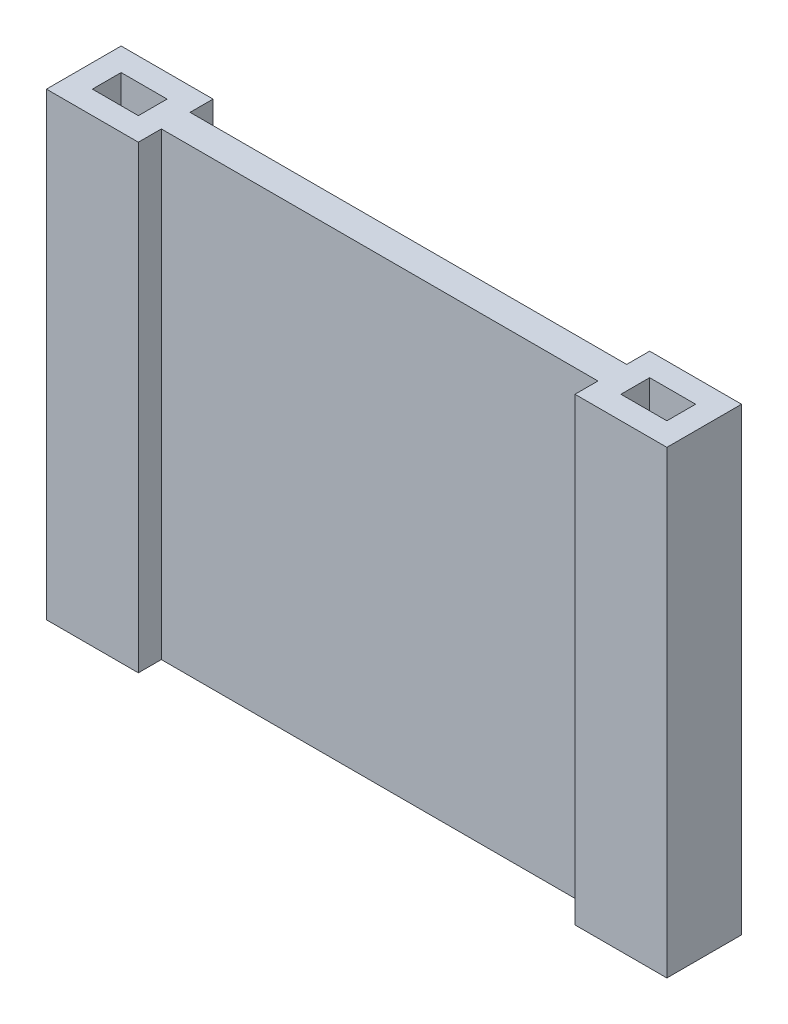
ISO-10303-21;
HEADER;
FILE_DESCRIPTION(('STEP AP214'),'2;1');
FILE_NAME('part.step','',(''),(''),'','','');
FILE_SCHEMA(('AUTOMOTIVE_DESIGN { 1 0 10303 214 1 1 1 1 }'));
ENDSEC;
DATA;
#1=APPLICATION_CONTEXT('core data for automotive mechanical design processes');
#2=APPLICATION_PROTOCOL_DEFINITION('international standard','automotive_design',2000,#1);
#3=PRODUCT_CONTEXT('',#1,'mechanical');
#4=PRODUCT('Part','Part','',(#3));
#5=PRODUCT_RELATED_PRODUCT_CATEGORY('part','',(#4));
#6=PRODUCT_DEFINITION_FORMATION('','',#4);
#7=PRODUCT_DEFINITION_CONTEXT('part definition',#1,'design');
#8=PRODUCT_DEFINITION('design','',#6,#7);
#9=PRODUCT_DEFINITION_SHAPE('','',#8);
#10=(LENGTH_UNIT() NAMED_UNIT(*) SI_UNIT(.MILLI.,.METRE.));
#11=(NAMED_UNIT(*) PLANE_ANGLE_UNIT() SI_UNIT($,.RADIAN.));
#12=(NAMED_UNIT(*) SI_UNIT($,.STERADIAN.) SOLID_ANGLE_UNIT());
#13=UNCERTAINTY_MEASURE_WITH_UNIT(LENGTH_MEASURE(1.E-05),#10,'distance_accuracy_value','');
#14=(GEOMETRIC_REPRESENTATION_CONTEXT(3) GLOBAL_UNCERTAINTY_ASSIGNED_CONTEXT((#13)) GLOBAL_UNIT_ASSIGNED_CONTEXT((#10,
#11,#12)) REPRESENTATION_CONTEXT('',''));
#15=CARTESIAN_POINT('',(0.,0.,0.));
#16=DIRECTION('',(0.,0.,1.));
#17=DIRECTION('',(1.,0.,0.));
#18=AXIS2_PLACEMENT_3D('',#15,#16,#17);
#19=CARTESIAN_POINT('',(80.,-80.,5.));
#20=DIRECTION('',(-1.,0.,0.));
#21=DIRECTION('',(0.,-1.,0.));
#22=AXIS2_PLACEMENT_3D('',#19,#20,#21);
#23=PLANE('',#22);
#24=DIRECTION('',(0.,-1.,0.));
#25=VECTOR('',#24,1.);
#26=CARTESIAN_POINT('',(80.,0.,0.));
#27=LINE('',#26,#25);
#28=CARTESIAN_POINT('',(80.,0.,0.));
#29=VERTEX_POINT('',#28);
#30=CARTESIAN_POINT('',(80.,-80.,0.));
#31=VERTEX_POINT('',#30);
#32=EDGE_CURVE('E258',#29,#31,#27,.T.);
#33=ORIENTED_EDGE('',*,*,#32,.F.);
#34=DIRECTION('',(0.,0.,-1.));
#35=VECTOR('',#34,1.);
#36=CARTESIAN_POINT('',(80.,0.,5.));
#37=LINE('',#36,#35);
#38=CARTESIAN_POINT('',(80.,0.,5.));
#39=VERTEX_POINT('',#38);
#40=EDGE_CURVE('E42',#39,#29,#37,.T.);
#41=ORIENTED_EDGE('',*,*,#40,.F.);
#42=DIRECTION('',(0.,1.,0.));
#43=VECTOR('',#42,1.);
#44=CARTESIAN_POINT('',(80.,-80.,5.));
#45=LINE('',#44,#43);
#46=CARTESIAN_POINT('',(80.,-80.,5.));
#47=VERTEX_POINT('',#46);
#48=EDGE_CURVE('E266',#47,#39,#45,.T.);
#49=ORIENTED_EDGE('',*,*,#48,.F.);
#50=DIRECTION('',(0.,0.,-1.));
#51=VECTOR('',#50,1.);
#52=CARTESIAN_POINT('',(80.,-80.,5.));
#53=LINE('',#52,#51);
#54=EDGE_CURVE('E11',#47,#31,#53,.T.);
#55=ORIENTED_EDGE('',*,*,#54,.T.);
#56=EDGE_LOOP('',(#33,#41,#49,#55));
#57=FACE_BOUND('',#56,.T.);
#58=ADVANCED_FACE('F34',(#57),#23,.F.);
#59=CARTESIAN_POINT('',(0.,0.,5.));
#60=DIRECTION('',(0.,0.,1.));
#61=DIRECTION('',(1.,0.,0.));
#62=AXIS2_PLACEMENT_3D('',#59,#60,#61);
#63=PLANE('',#62);
#64=DIRECTION('',(1.,0.,0.));
#65=VECTOR('',#64,1.);
#66=CARTESIAN_POINT('',(0.,-80.,5.));
#67=LINE('',#66,#65);
#68=CARTESIAN_POINT('',(0.,-80.,5.));
#69=VERTEX_POINT('',#68);
#70=CARTESIAN_POINT('',(76.,-80.,5.));
#71=VERTEX_POINT('',#70);
#72=EDGE_CURVE('E323',#69,#71,#67,.T.);
#73=ORIENTED_EDGE('',*,*,#72,.T.);
#74=DIRECTION('',(0.,1.,0.));
#75=VECTOR('',#74,1.);
#76=CARTESIAN_POINT('',(76.,-80.,5.));
#77=LINE('',#76,#75);
#78=CARTESIAN_POINT('',(76.,0.,5.));
#79=VERTEX_POINT('',#78);
#80=EDGE_CURVE('E297',#71,#79,#77,.T.);
#81=ORIENTED_EDGE('',*,*,#80,.T.);
#82=DIRECTION('',(-1.,0.,0.));
#83=VECTOR('',#82,1.);
#84=CARTESIAN_POINT('',(80.,0.,5.));
#85=LINE('',#84,#83);
#86=CARTESIAN_POINT('',(0.,0.,5.));
#87=VERTEX_POINT('',#86);
#88=EDGE_CURVE('E316',#79,#87,#85,.T.);
#89=ORIENTED_EDGE('',*,*,#88,.T.);
#90=DIRECTION('',(0.,-1.,0.));
#91=VECTOR('',#90,1.);
#92=CARTESIAN_POINT('',(0.,0.,5.));
#93=LINE('',#92,#91);
#94=EDGE_CURVE('E319',#87,#69,#93,.T.);
#95=ORIENTED_EDGE('',*,*,#94,.T.);
#96=EDGE_LOOP('',(#73,#81,#89,#95));
#97=FACE_BOUND('',#96,.T.);
#98=ADVANCED_FACE('F362',(#97),#63,.T.);
#99=CARTESIAN_POINT('',(80.,0.,5.));
#100=DIRECTION('',(0.,-1.,0.));
#101=DIRECTION('',(1.,0.,0.));
#102=AXIS2_PLACEMENT_3D('',#99,#100,#101);
#103=PLANE('',#102);
#104=DIRECTION('',(0.,0.,1.));
#105=VECTOR('',#104,1.);
#106=CARTESIAN_POINT('',(88.,0.,0.));
#107=LINE('',#106,#105);
#108=CARTESIAN_POINT('',(88.,0.,0.));
#109=VERTEX_POINT('',#108);
#110=CARTESIAN_POINT('',(88.,0.,5.));
#111=VERTEX_POINT('',#110);
#112=EDGE_CURVE('E49',#109,#111,#107,.T.);
#113=ORIENTED_EDGE('',*,*,#112,.T.);
#114=DIRECTION('',(-1.,0.,0.));
#115=VECTOR('',#114,1.);
#116=CARTESIAN_POINT('',(92.,0.,5.));
#117=LINE('',#116,#115);
#118=EDGE_CURVE('E279',#111,#39,#117,.T.);
#119=ORIENTED_EDGE('',*,*,#118,.T.);
#120=ORIENTED_EDGE('',*,*,#40,.T.);
#121=DIRECTION('',(-1.,0.,0.));
#122=VECTOR('',#121,1.);
#123=CARTESIAN_POINT('',(92.,0.,0.));
#124=LINE('',#123,#122);
#125=EDGE_CURVE('E56',#109,#29,#124,.T.);
#126=ORIENTED_EDGE('',*,*,#125,.F.);
#127=EDGE_LOOP('',(#113,#119,#120,#126));
#128=FACE_BOUND('',#127,.T.);
#129=DIRECTION('',(1.,0.,0.));
#130=VECTOR('',#129,1.);
#131=CARTESIAN_POINT('',(76.,0.,9.));
#132=LINE('',#131,#130);
#133=CARTESIAN_POINT('',(76.,0.,9.));
#134=VERTEX_POINT('',#133);
#135=CARTESIAN_POINT('',(92.,0.,9.));
#136=VERTEX_POINT('',#135);
#137=EDGE_CURVE('E311',#134,#136,#132,.T.);
#138=ORIENTED_EDGE('',*,*,#137,.T.);
#139=DIRECTION('',(0.,0.,1.));
#140=VECTOR('',#139,1.);
#141=CARTESIAN_POINT('',(92.,0.,5.));
#142=LINE('',#141,#140);
#143=CARTESIAN_POINT('',(92.,0.,-4.));
#144=VERTEX_POINT('',#143);
#145=EDGE_CURVE('E267',#144,#136,#142,.T.);
#146=ORIENTED_EDGE('',*,*,#145,.F.);
#147=DIRECTION('',(1.,0.,0.));
#148=VECTOR('',#147,1.);
#149=CARTESIAN_POINT('',(76.,0.,-4.));
#150=LINE('',#149,#148);
#151=CARTESIAN_POINT('',(76.,0.,-4.));
#152=VERTEX_POINT('',#151);
#153=EDGE_CURVE('E294',#152,#144,#150,.T.);
#154=ORIENTED_EDGE('',*,*,#153,.F.);
#155=DIRECTION('',(0.,0.,1.));
#156=VECTOR('',#155,1.);
#157=CARTESIAN_POINT('',(76.,0.,0.));
#158=LINE('',#157,#156);
#159=CARTESIAN_POINT('',(76.,0.,0.));
#160=VERTEX_POINT('',#159);
#161=EDGE_CURVE('E290',#152,#160,#158,.T.);
#162=ORIENTED_EDGE('',*,*,#161,.T.);
#163=DIRECTION('',(-1.,0.,0.));
#164=VECTOR('',#163,1.);
#165=CARTESIAN_POINT('',(80.,0.,0.));
#166=LINE('',#165,#164);
#167=CARTESIAN_POINT('',(0.,0.,0.));
#168=VERTEX_POINT('',#167);
#169=EDGE_CURVE('E314',#160,#168,#166,.T.);
#170=ORIENTED_EDGE('',*,*,#169,.T.);
#171=DIRECTION('',(0.,0.,-1.));
#172=VECTOR('',#171,1.);
#173=CARTESIAN_POINT('',(0.,0.,0.));
#174=LINE('',#173,#172);
#175=CARTESIAN_POINT('',(0.,0.,-4.));
#176=VERTEX_POINT('',#175);
#177=EDGE_CURVE('E206',#168,#176,#174,.T.);
#178=ORIENTED_EDGE('',*,*,#177,.T.);
#179=DIRECTION('',(-1.,0.,0.));
#180=VECTOR('',#179,1.);
#181=CARTESIAN_POINT('',(0.,0.,-4.));
#182=LINE('',#181,#180);
#183=CARTESIAN_POINT('',(-16.,0.,-4.));
#184=VERTEX_POINT('',#183);
#185=EDGE_CURVE('E180',#176,#184,#182,.T.);
#186=ORIENTED_EDGE('',*,*,#185,.T.);
#187=DIRECTION('',(0.,0.,1.));
#188=VECTOR('',#187,1.);
#189=CARTESIAN_POINT('',(-16.,0.,0.));
#190=LINE('',#189,#188);
#191=CARTESIAN_POINT('',(-16.,0.,9.));
#192=VERTEX_POINT('',#191);
#193=EDGE_CURVE('E172',#184,#192,#190,.T.);
#194=ORIENTED_EDGE('',*,*,#193,.T.);
#195=DIRECTION('',(1.,0.,0.));
#196=VECTOR('',#195,1.);
#197=CARTESIAN_POINT('',(0.,0.,9.));
#198=LINE('',#197,#196);
#199=CARTESIAN_POINT('',(0.,0.,9.));
#200=VERTEX_POINT('',#199);
#201=EDGE_CURVE('E177',#192,#200,#198,.T.);
#202=ORIENTED_EDGE('',*,*,#201,.T.);
#203=EDGE_CURVE('E207',#200,#87,#174,.T.);
#204=ORIENTED_EDGE('',*,*,#203,.T.);
#205=ORIENTED_EDGE('',*,*,#88,.F.);
#206=DIRECTION('',(0.,0.,1.));
#207=VECTOR('',#206,1.);
#208=CARTESIAN_POINT('',(76.,0.,5.));
#209=LINE('',#208,#207);
#210=EDGE_CURVE('E302',#79,#134,#209,.T.);
#211=ORIENTED_EDGE('',*,*,#210,.T.);
#212=EDGE_LOOP('',(#138,#146,#154,#162,#170,#178,#186,#194,#202,#204,#205,#211));
#213=FACE_BOUND('',#212,.T.);
#214=DIRECTION('',(0.,0.,1.));
#215=VECTOR('',#214,1.);
#216=CARTESIAN_POINT('',(-12.,0.,0.));
#217=LINE('',#216,#215);
#218=CARTESIAN_POINT('',(-12.,0.,0.));
#219=VERTEX_POINT('',#218);
#220=CARTESIAN_POINT('',(-12.,0.,5.));
#221=VERTEX_POINT('',#220);
#222=EDGE_CURVE('E209',#219,#221,#217,.T.);
#223=ORIENTED_EDGE('',*,*,#222,.F.);
#224=DIRECTION('',(-1.,0.,0.));
#225=VECTOR('',#224,1.);
#226=CARTESIAN_POINT('',(0.,0.,0.));
#227=LINE('',#226,#225);
#228=CARTESIAN_POINT('',(-4.,0.,0.));
#229=VERTEX_POINT('',#228);
#230=EDGE_CURVE('E194',#229,#219,#227,.T.);
#231=ORIENTED_EDGE('',*,*,#230,.F.);
#232=DIRECTION('',(0.,0.,-1.));
#233=VECTOR('',#232,1.);
#234=CARTESIAN_POINT('',(-4.,0.,0.));
#235=LINE('',#234,#233);
#236=CARTESIAN_POINT('',(-4.,0.,5.));
#237=VERTEX_POINT('',#236);
#238=EDGE_CURVE('E215',#237,#229,#235,.T.);
#239=ORIENTED_EDGE('',*,*,#238,.F.);
#240=DIRECTION('',(1.,0.,0.));
#241=VECTOR('',#240,1.);
#242=CARTESIAN_POINT('',(0.,0.,5.));
#243=LINE('',#242,#241);
#244=EDGE_CURVE('E212',#221,#237,#243,.T.);
#245=ORIENTED_EDGE('',*,*,#244,.F.);
#246=EDGE_LOOP('',(#223,#231,#239,#245));
#247=FACE_BOUND('',#246,.T.);
#248=ADVANCED_FACE('F36',(#128,#213,#247),#103,.F.);
#249=CARTESIAN_POINT('',(0.,-80.,5.));
#250=DIRECTION('',(0.,1.,0.));
#251=DIRECTION('',(0.,0.,1.));
#252=AXIS2_PLACEMENT_3D('',#249,#250,#251);
#253=PLANE('',#252);
#254=DIRECTION('',(0.,0.,-1.));
#255=VECTOR('',#254,1.);
#256=CARTESIAN_POINT('',(92.,-80.,9.));
#257=LINE('',#256,#255);
#258=CARTESIAN_POINT('',(92.,-80.,9.));
#259=VERTEX_POINT('',#258);
#260=CARTESIAN_POINT('',(92.,-80.,-4.));
#261=VERTEX_POINT('',#260);
#262=EDGE_CURVE('E273',#259,#261,#257,.T.);
#263=ORIENTED_EDGE('',*,*,#262,.F.);
#264=DIRECTION('',(1.,0.,0.));
#265=VECTOR('',#264,1.);
#266=CARTESIAN_POINT('',(76.,-80.,9.));
#267=LINE('',#266,#265);
#268=CARTESIAN_POINT('',(76.,-80.,9.));
#269=VERTEX_POINT('',#268);
#270=EDGE_CURVE('E312',#269,#259,#267,.T.);
#271=ORIENTED_EDGE('',*,*,#270,.F.);
#272=DIRECTION('',(0.,0.,-1.));
#273=VECTOR('',#272,1.);
#274=CARTESIAN_POINT('',(76.,-80.,9.));
#275=LINE('',#274,#273);
#276=EDGE_CURVE('E308',#269,#71,#275,.T.);
#277=ORIENTED_EDGE('',*,*,#276,.T.);
#278=ORIENTED_EDGE('',*,*,#72,.F.);
#279=DIRECTION('',(0.,0.,-1.));
#280=VECTOR('',#279,1.);
#281=CARTESIAN_POINT('',(0.,-80.,0.));
#282=LINE('',#281,#280);
#283=CARTESIAN_POINT('',(0.,-80.,9.));
#284=VERTEX_POINT('',#283);
#285=EDGE_CURVE('E226',#284,#69,#282,.T.);
#286=ORIENTED_EDGE('',*,*,#285,.F.);
#287=DIRECTION('',(1.,0.,0.));
#288=VECTOR('',#287,1.);
#289=CARTESIAN_POINT('',(0.,-80.,9.));
#290=LINE('',#289,#288);
#291=CARTESIAN_POINT('',(-16.,-80.,9.));
#292=VERTEX_POINT('',#291);
#293=EDGE_CURVE('E220',#292,#284,#290,.T.);
#294=ORIENTED_EDGE('',*,*,#293,.F.);
#295=DIRECTION('',(0.,0.,1.));
#296=VECTOR('',#295,1.);
#297=CARTESIAN_POINT('',(-16.,-80.,0.));
#298=LINE('',#297,#296);
#299=CARTESIAN_POINT('',(-16.,-80.,-4.));
#300=VERTEX_POINT('',#299);
#301=EDGE_CURVE('E189',#300,#292,#298,.T.);
#302=ORIENTED_EDGE('',*,*,#301,.F.);
#303=DIRECTION('',(-1.,0.,0.));
#304=VECTOR('',#303,1.);
#305=CARTESIAN_POINT('',(0.,-80.,-4.));
#306=LINE('',#305,#304);
#307=CARTESIAN_POINT('',(0.,-80.,-4.));
#308=VERTEX_POINT('',#307);
#309=EDGE_CURVE('E223',#308,#300,#306,.T.);
#310=ORIENTED_EDGE('',*,*,#309,.F.);
#311=CARTESIAN_POINT('',(0.,-80.,0.));
#312=VERTEX_POINT('',#311);
#313=EDGE_CURVE('E225',#312,#308,#282,.T.);
#314=ORIENTED_EDGE('',*,*,#313,.F.);
#315=DIRECTION('',(1.,0.,0.));
#316=VECTOR('',#315,1.);
#317=CARTESIAN_POINT('',(0.,-80.,0.));
#318=LINE('',#317,#316);
#319=CARTESIAN_POINT('',(76.,-80.,0.));
#320=VERTEX_POINT('',#319);
#321=EDGE_CURVE('E320',#312,#320,#318,.T.);
#322=ORIENTED_EDGE('',*,*,#321,.T.);
#323=DIRECTION('',(0.,0.,-1.));
#324=VECTOR('',#323,1.);
#325=CARTESIAN_POINT('',(76.,-80.,0.));
#326=LINE('',#325,#324);
#327=CARTESIAN_POINT('',(76.,-80.,-4.));
#328=VERTEX_POINT('',#327);
#329=EDGE_CURVE('E284',#320,#328,#326,.T.);
#330=ORIENTED_EDGE('',*,*,#329,.T.);
#331=DIRECTION('',(1.,0.,0.));
#332=VECTOR('',#331,1.);
#333=CARTESIAN_POINT('',(76.,-80.,-4.));
#334=LINE('',#333,#332);
#335=EDGE_CURVE('E293',#328,#261,#334,.T.);
#336=ORIENTED_EDGE('',*,*,#335,.T.);
#337=EDGE_LOOP('',(#263,#271,#277,#278,#286,#294,#302,#310,#314,#322,#330,#336));
#338=FACE_BOUND('',#337,.T.);
#339=DIRECTION('',(-1.,0.,0.));
#340=VECTOR('',#339,1.);
#341=CARTESIAN_POINT('',(92.,-80.,5.));
#342=LINE('',#341,#340);
#343=CARTESIAN_POINT('',(88.,-80.,5.));
#344=VERTEX_POINT('',#343);
#345=EDGE_CURVE('E275',#344,#47,#342,.T.);
#346=ORIENTED_EDGE('',*,*,#345,.F.);
#347=DIRECTION('',(0.,0.,1.));
#348=VECTOR('',#347,1.);
#349=CARTESIAN_POINT('',(88.,-80.,0.));
#350=LINE('',#349,#348);
#351=CARTESIAN_POINT('',(88.,-80.,0.));
#352=VERTEX_POINT('',#351);
#353=EDGE_CURVE('E252',#352,#344,#350,.T.);
#354=ORIENTED_EDGE('',*,*,#353,.F.);
#355=DIRECTION('',(-1.,0.,0.));
#356=VECTOR('',#355,1.);
#357=CARTESIAN_POINT('',(92.,-80.,0.));
#358=LINE('',#357,#356);
#359=EDGE_CURVE('E264',#352,#31,#358,.T.);
#360=ORIENTED_EDGE('',*,*,#359,.T.);
#361=ORIENTED_EDGE('',*,*,#54,.F.);
#362=EDGE_LOOP('',(#346,#354,#360,#361));
#363=FACE_BOUND('',#362,.T.);
#364=DIRECTION('',(0.,0.,1.));
#365=VECTOR('',#364,1.);
#366=CARTESIAN_POINT('',(-12.,-80.,0.));
#367=LINE('',#366,#365);
#368=CARTESIAN_POINT('',(-12.,-80.,0.));
#369=VERTEX_POINT('',#368);
#370=CARTESIAN_POINT('',(-12.,-80.,5.));
#371=VERTEX_POINT('',#370);
#372=EDGE_CURVE('E228',#369,#371,#367,.T.);
#373=ORIENTED_EDGE('',*,*,#372,.T.);
#374=DIRECTION('',(1.,0.,0.));
#375=VECTOR('',#374,1.);
#376=CARTESIAN_POINT('',(0.,-80.,5.));
#377=LINE('',#376,#375);
#378=CARTESIAN_POINT('',(-4.,-80.,5.));
#379=VERTEX_POINT('',#378);
#380=EDGE_CURVE('E231',#371,#379,#377,.T.);
#381=ORIENTED_EDGE('',*,*,#380,.T.);
#382=DIRECTION('',(0.,0.,-1.));
#383=VECTOR('',#382,1.);
#384=CARTESIAN_POINT('',(-4.,-80.,0.));
#385=LINE('',#384,#383);
#386=CARTESIAN_POINT('',(-4.,-80.,0.));
#387=VERTEX_POINT('',#386);
#388=EDGE_CURVE('E202',#379,#387,#385,.T.);
#389=ORIENTED_EDGE('',*,*,#388,.T.);
#390=DIRECTION('',(-1.,0.,0.));
#391=VECTOR('',#390,1.);
#392=CARTESIAN_POINT('',(0.,-80.,0.));
#393=LINE('',#392,#391);
#394=EDGE_CURVE('E199',#387,#369,#393,.T.);
#395=ORIENTED_EDGE('',*,*,#394,.T.);
#396=EDGE_LOOP('',(#373,#381,#389,#395));
#397=FACE_BOUND('',#396,.T.);
#398=ADVANCED_FACE('F341',(#338,#363,#397),#253,.F.);
#399=CARTESIAN_POINT('',(0.,0.,0.));
#400=DIRECTION('',(0.,0.,1.));
#401=DIRECTION('',(1.,0.,0.));
#402=AXIS2_PLACEMENT_3D('',#399,#400,#401);
#403=PLANE('',#402);
#404=ORIENTED_EDGE('',*,*,#169,.F.);
#405=DIRECTION('',(0.,-1.,0.));
#406=VECTOR('',#405,1.);
#407=CARTESIAN_POINT('',(76.,0.,0.));
#408=LINE('',#407,#406);
#409=EDGE_CURVE('E281',#160,#320,#408,.T.);
#410=ORIENTED_EDGE('',*,*,#409,.T.);
#411=ORIENTED_EDGE('',*,*,#321,.F.);
#412=DIRECTION('',(0.,-1.,0.));
#413=VECTOR('',#412,1.);
#414=CARTESIAN_POINT('',(0.,0.,0.));
#415=LINE('',#414,#413);
#416=EDGE_CURVE('E328',#168,#312,#415,.T.);
#417=ORIENTED_EDGE('',*,*,#416,.F.);
#418=EDGE_LOOP('',(#404,#410,#411,#417));
#419=FACE_BOUND('',#418,.T.);
#420=ADVANCED_FACE('F370',(#419),#403,.F.);
#421=CARTESIAN_POINT('',(76.,0.,9.));
#422=DIRECTION('',(0.,0.,1.));
#423=DIRECTION('',(1.,0.,0.));
#424=AXIS2_PLACEMENT_3D('',#421,#422,#423);
#425=PLANE('',#424);
#426=ORIENTED_EDGE('',*,*,#270,.T.);
#427=DIRECTION('',(0.,-1.,0.));
#428=VECTOR('',#427,1.);
#429=CARTESIAN_POINT('',(92.,0.,9.));
#430=LINE('',#429,#428);
#431=EDGE_CURVE('E270',#136,#259,#430,.T.);
#432=ORIENTED_EDGE('',*,*,#431,.F.);
#433=ORIENTED_EDGE('',*,*,#137,.F.);
#434=DIRECTION('',(0.,-1.,0.));
#435=VECTOR('',#434,1.);
#436=CARTESIAN_POINT('',(76.,0.,9.));
#437=LINE('',#436,#435);
#438=EDGE_CURVE('E305',#134,#269,#437,.T.);
#439=ORIENTED_EDGE('',*,*,#438,.T.);
#440=EDGE_LOOP('',(#426,#432,#433,#439));
#441=FACE_BOUND('',#440,.T.);
#442=ADVANCED_FACE('F377',(#441),#425,.T.);
#443=CARTESIAN_POINT('',(76.,0.,0.));
#444=DIRECTION('',(1.,0.,0.));
#445=DIRECTION('',(0.,1.,0.));
#446=AXIS2_PLACEMENT_3D('',#443,#444,#445);
#447=PLANE('',#446);
#448=ORIENTED_EDGE('',*,*,#80,.F.);
#449=ORIENTED_EDGE('',*,*,#276,.F.);
#450=ORIENTED_EDGE('',*,*,#438,.F.);
#451=ORIENTED_EDGE('',*,*,#210,.F.);
#452=EDGE_LOOP('',(#448,#449,#450,#451));
#453=FACE_BOUND('',#452,.T.);
#454=ADVANCED_FACE('F387',(#453),#447,.F.);
#455=CARTESIAN_POINT('',(76.,-80.,-4.));
#456=DIRECTION('',(0.,0.,-1.));
#457=DIRECTION('',(-1.,0.,0.));
#458=AXIS2_PLACEMENT_3D('',#455,#456,#457);
#459=PLANE('',#458);
#460=ORIENTED_EDGE('',*,*,#153,.T.);
#461=DIRECTION('',(0.,1.,0.));
#462=VECTOR('',#461,1.);
#463=CARTESIAN_POINT('',(92.,-80.,-4.));
#464=LINE('',#463,#462);
#465=EDGE_CURVE('E259',#261,#144,#464,.T.);
#466=ORIENTED_EDGE('',*,*,#465,.F.);
#467=ORIENTED_EDGE('',*,*,#335,.F.);
#468=DIRECTION('',(0.,1.,0.));
#469=VECTOR('',#468,1.);
#470=CARTESIAN_POINT('',(76.,-80.,-4.));
#471=LINE('',#470,#469);
#472=EDGE_CURVE('E287',#328,#152,#471,.T.);
#473=ORIENTED_EDGE('',*,*,#472,.T.);
#474=EDGE_LOOP('',(#460,#466,#467,#473));
#475=FACE_BOUND('',#474,.T.);
#476=ADVANCED_FACE('F392',(#475),#459,.T.);
#477=CARTESIAN_POINT('',(76.,0.,0.));
#478=DIRECTION('',(1.,0.,0.));
#479=DIRECTION('',(0.,1.,0.));
#480=AXIS2_PLACEMENT_3D('',#477,#478,#479);
#481=PLANE('',#480);
#482=ORIENTED_EDGE('',*,*,#409,.F.);
#483=ORIENTED_EDGE('',*,*,#161,.F.);
#484=ORIENTED_EDGE('',*,*,#472,.F.);
#485=ORIENTED_EDGE('',*,*,#329,.F.);
#486=EDGE_LOOP('',(#482,#483,#484,#485));
#487=FACE_BOUND('',#486,.T.);
#488=ADVANCED_FACE('F396',(#487),#481,.F.);
#489=CARTESIAN_POINT('',(92.,-80.,5.));
#490=DIRECTION('',(0.,0.,1.));
#491=DIRECTION('',(1.,0.,0.));
#492=AXIS2_PLACEMENT_3D('',#489,#490,#491);
#493=PLANE('',#492);
#494=ORIENTED_EDGE('',*,*,#118,.F.);
#495=DIRECTION('',(0.,-1.,0.));
#496=VECTOR('',#495,1.);
#497=CARTESIAN_POINT('',(88.,-80.,5.));
#498=LINE('',#497,#496);
#499=EDGE_CURVE('E254',#111,#344,#498,.T.);
#500=ORIENTED_EDGE('',*,*,#499,.T.);
#501=ORIENTED_EDGE('',*,*,#345,.T.);
#502=ORIENTED_EDGE('',*,*,#48,.T.);
#503=EDGE_LOOP('',(#494,#500,#501,#502));
#504=FACE_BOUND('',#503,.T.);
#505=ADVANCED_FACE('F338',(#504),#493,.F.);
#506=CARTESIAN_POINT('',(92.,0.,0.));
#507=DIRECTION('',(1.,0.,0.));
#508=DIRECTION('',(0.,1.,0.));
#509=AXIS2_PLACEMENT_3D('',#506,#507,#508);
#510=PLANE('',#509);
#511=ORIENTED_EDGE('',*,*,#262,.T.);
#512=ORIENTED_EDGE('',*,*,#465,.T.);
#513=ORIENTED_EDGE('',*,*,#145,.T.);
#514=ORIENTED_EDGE('',*,*,#431,.T.);
#515=EDGE_LOOP('',(#511,#512,#513,#514));
#516=FACE_BOUND('',#515,.T.);
#517=ADVANCED_FACE('F358',(#516),#510,.T.);
#518=CARTESIAN_POINT('',(92.,0.,0.));
#519=DIRECTION('',(0.,0.,-1.));
#520=DIRECTION('',(-1.,0.,0.));
#521=AXIS2_PLACEMENT_3D('',#518,#519,#520);
#522=PLANE('',#521);
#523=ORIENTED_EDGE('',*,*,#359,.F.);
#524=DIRECTION('',(0.,-1.,0.));
#525=VECTOR('',#524,1.);
#526=CARTESIAN_POINT('',(88.,0.,0.));
#527=LINE('',#526,#525);
#528=EDGE_CURVE('E238',#109,#352,#527,.T.);
#529=ORIENTED_EDGE('',*,*,#528,.F.);
#530=ORIENTED_EDGE('',*,*,#125,.T.);
#531=ORIENTED_EDGE('',*,*,#32,.T.);
#532=EDGE_LOOP('',(#523,#529,#530,#531));
#533=FACE_BOUND('',#532,.T.);
#534=ADVANCED_FACE('F344',(#533),#522,.F.);
#535=CARTESIAN_POINT('',(88.,0.,0.));
#536=DIRECTION('',(-1.,0.,0.));
#537=DIRECTION('',(0.,0.,1.));
#538=AXIS2_PLACEMENT_3D('',#535,#536,#537);
#539=PLANE('',#538);
#540=ORIENTED_EDGE('',*,*,#499,.F.);
#541=ORIENTED_EDGE('',*,*,#112,.F.);
#542=ORIENTED_EDGE('',*,*,#528,.T.);
#543=ORIENTED_EDGE('',*,*,#353,.T.);
#544=EDGE_LOOP('',(#540,#541,#542,#543));
#545=FACE_BOUND('',#544,.T.);
#546=ADVANCED_FACE('F346',(#545),#539,.T.);
#547=CARTESIAN_POINT('',(0.,0.,0.));
#548=DIRECTION('',(-1.,0.,0.));
#549=DIRECTION('',(0.,0.,1.));
#550=AXIS2_PLACEMENT_3D('',#547,#548,#549);
#551=PLANE('',#550);
#552=ORIENTED_EDGE('',*,*,#177,.F.);
#553=ORIENTED_EDGE('',*,*,#416,.T.);
#554=ORIENTED_EDGE('',*,*,#313,.T.);
#555=DIRECTION('',(0.,-1.,0.));
#556=VECTOR('',#555,1.);
#557=CARTESIAN_POINT('',(0.,0.,-4.));
#558=LINE('',#557,#556);
#559=EDGE_CURVE('E246',#176,#308,#558,.T.);
#560=ORIENTED_EDGE('',*,*,#559,.F.);
#561=EDGE_LOOP('',(#552,#553,#554,#560));
#562=FACE_BOUND('',#561,.T.);
#563=ADVANCED_FACE('F348',(#562),#551,.F.);
#564=CARTESIAN_POINT('',(-12.,0.,0.));
#565=DIRECTION('',(1.,0.,0.));
#566=DIRECTION('',(0.,0.,-1.));
#567=AXIS2_PLACEMENT_3D('',#564,#565,#566);
#568=PLANE('',#567);
#569=ORIENTED_EDGE('',*,*,#372,.F.);
#570=DIRECTION('',(0.,-1.,0.));
#571=VECTOR('',#570,1.);
#572=CARTESIAN_POINT('',(-12.,0.,0.));
#573=LINE('',#572,#571);
#574=EDGE_CURVE('E236',#219,#369,#573,.T.);
#575=ORIENTED_EDGE('',*,*,#574,.F.);
#576=ORIENTED_EDGE('',*,*,#222,.T.);
#577=DIRECTION('',(0.,-1.,0.));
#578=VECTOR('',#577,1.);
#579=CARTESIAN_POINT('',(-12.,0.,5.));
#580=LINE('',#579,#578);
#581=EDGE_CURVE('E243',#221,#371,#580,.T.);
#582=ORIENTED_EDGE('',*,*,#581,.T.);
#583=EDGE_LOOP('',(#569,#575,#576,#582));
#584=FACE_BOUND('',#583,.T.);
#585=ADVANCED_FACE('F354',(#584),#568,.T.);
#586=CARTESIAN_POINT('',(0.,0.,0.));
#587=DIRECTION('',(0.,0.,1.));
#588=DIRECTION('',(1.,0.,0.));
#589=AXIS2_PLACEMENT_3D('',#586,#587,#588);
#590=PLANE('',#589);
#591=ORIENTED_EDGE('',*,*,#394,.F.);
#592=DIRECTION('',(0.,-1.,0.));
#593=VECTOR('',#592,1.);
#594=CARTESIAN_POINT('',(-4.,0.,0.));
#595=LINE('',#594,#593);
#596=EDGE_CURVE('E239',#229,#387,#595,.T.);
#597=ORIENTED_EDGE('',*,*,#596,.F.);
#598=ORIENTED_EDGE('',*,*,#230,.T.);
#599=ORIENTED_EDGE('',*,*,#574,.T.);
#600=EDGE_LOOP('',(#591,#597,#598,#599));
#601=FACE_BOUND('',#600,.T.);
#602=ADVANCED_FACE('F419',(#601),#590,.T.);
#603=CARTESIAN_POINT('',(-4.,0.,0.));
#604=DIRECTION('',(-1.,0.,0.));
#605=DIRECTION('',(0.,0.,1.));
#606=AXIS2_PLACEMENT_3D('',#603,#604,#605);
#607=PLANE('',#606);
#608=ORIENTED_EDGE('',*,*,#388,.F.);
#609=DIRECTION('',(0.,-1.,0.));
#610=VECTOR('',#609,1.);
#611=CARTESIAN_POINT('',(-4.,0.,5.));
#612=LINE('',#611,#610);
#613=EDGE_CURVE('E241',#237,#379,#612,.T.);
#614=ORIENTED_EDGE('',*,*,#613,.F.);
#615=ORIENTED_EDGE('',*,*,#238,.T.);
#616=ORIENTED_EDGE('',*,*,#596,.T.);
#617=EDGE_LOOP('',(#608,#614,#615,#616));
#618=FACE_BOUND('',#617,.T.);
#619=ADVANCED_FACE('F415',(#618),#607,.T.);
#620=CARTESIAN_POINT('',(0.,0.,9.));
#621=DIRECTION('',(0.,0.,-1.));
#622=DIRECTION('',(-1.,0.,0.));
#623=AXIS2_PLACEMENT_3D('',#620,#621,#622);
#624=PLANE('',#623);
#625=ORIENTED_EDGE('',*,*,#293,.T.);
#626=DIRECTION('',(0.,-1.,0.));
#627=VECTOR('',#626,1.);
#628=CARTESIAN_POINT('',(0.,0.,9.));
#629=LINE('',#628,#627);
#630=EDGE_CURVE('E198',#200,#284,#629,.T.);
#631=ORIENTED_EDGE('',*,*,#630,.F.);
#632=ORIENTED_EDGE('',*,*,#201,.F.);
#633=DIRECTION('',(0.,-1.,0.));
#634=VECTOR('',#633,1.);
#635=CARTESIAN_POINT('',(-16.,0.,9.));
#636=LINE('',#635,#634);
#637=EDGE_CURVE('E186',#192,#292,#636,.T.);
#638=ORIENTED_EDGE('',*,*,#637,.T.);
#639=EDGE_LOOP('',(#625,#631,#632,#638));
#640=FACE_BOUND('',#639,.T.);
#641=ADVANCED_FACE('F196',(#640),#624,.F.);
#642=ORIENTED_EDGE('',*,*,#94,.F.);
#643=ORIENTED_EDGE('',*,*,#203,.F.);
#644=ORIENTED_EDGE('',*,*,#630,.T.);
#645=ORIENTED_EDGE('',*,*,#285,.T.);
#646=EDGE_LOOP('',(#642,#643,#644,#645));
#647=FACE_BOUND('',#646,.T.);
#648=ADVANCED_FACE('F357',(#647),#551,.F.);
#649=CARTESIAN_POINT('',(0.,0.,-4.));
#650=DIRECTION('',(0.,0.,1.));
#651=DIRECTION('',(1.,0.,0.));
#652=AXIS2_PLACEMENT_3D('',#649,#650,#651);
#653=PLANE('',#652);
#654=ORIENTED_EDGE('',*,*,#309,.T.);
#655=DIRECTION('',(0.,-1.,0.));
#656=VECTOR('',#655,1.);
#657=CARTESIAN_POINT('',(-16.,0.,-4.));
#658=LINE('',#657,#656);
#659=EDGE_CURVE('E193',#184,#300,#658,.T.);
#660=ORIENTED_EDGE('',*,*,#659,.F.);
#661=ORIENTED_EDGE('',*,*,#185,.F.);
#662=ORIENTED_EDGE('',*,*,#559,.T.);
#663=EDGE_LOOP('',(#654,#660,#661,#662));
#664=FACE_BOUND('',#663,.T.);
#665=ADVANCED_FACE('F404',(#664),#653,.F.);
#666=CARTESIAN_POINT('',(-16.,0.,0.));
#667=DIRECTION('',(1.,0.,0.));
#668=DIRECTION('',(0.,0.,-1.));
#669=AXIS2_PLACEMENT_3D('',#666,#667,#668);
#670=PLANE('',#669);
#671=ORIENTED_EDGE('',*,*,#301,.T.);
#672=ORIENTED_EDGE('',*,*,#637,.F.);
#673=ORIENTED_EDGE('',*,*,#193,.F.);
#674=ORIENTED_EDGE('',*,*,#659,.T.);
#675=EDGE_LOOP('',(#671,#672,#673,#674));
#676=FACE_BOUND('',#675,.T.);
#677=ADVANCED_FACE('F187',(#676),#670,.F.);
#678=CARTESIAN_POINT('',(0.,0.,5.));
#679=DIRECTION('',(0.,0.,-1.));
#680=DIRECTION('',(-1.,0.,0.));
#681=AXIS2_PLACEMENT_3D('',#678,#679,#680);
#682=PLANE('',#681);
#683=ORIENTED_EDGE('',*,*,#380,.F.);
#684=ORIENTED_EDGE('',*,*,#581,.F.);
#685=ORIENTED_EDGE('',*,*,#244,.T.);
#686=ORIENTED_EDGE('',*,*,#613,.T.);
#687=EDGE_LOOP('',(#683,#684,#685,#686));
#688=FACE_BOUND('',#687,.T.);
#689=ADVANCED_FACE('F411',(#688),#682,.T.);
#690=CLOSED_SHELL('',(#58,#98,#248,#398,#420,#442,#454,#476,#488,#505,#517,#534,#546,#563,#585,
#602,#619,#641,#648,#665,#677,#689));
#691=MANIFOLD_SOLID_BREP('B2',#690);
#692=ADVANCED_BREP_SHAPE_REPRESENTATION('',(#18,#691),#14);
#693=SHAPE_DEFINITION_REPRESENTATION(#9,#692);
ENDSEC;
END-ISO-10303-21;
